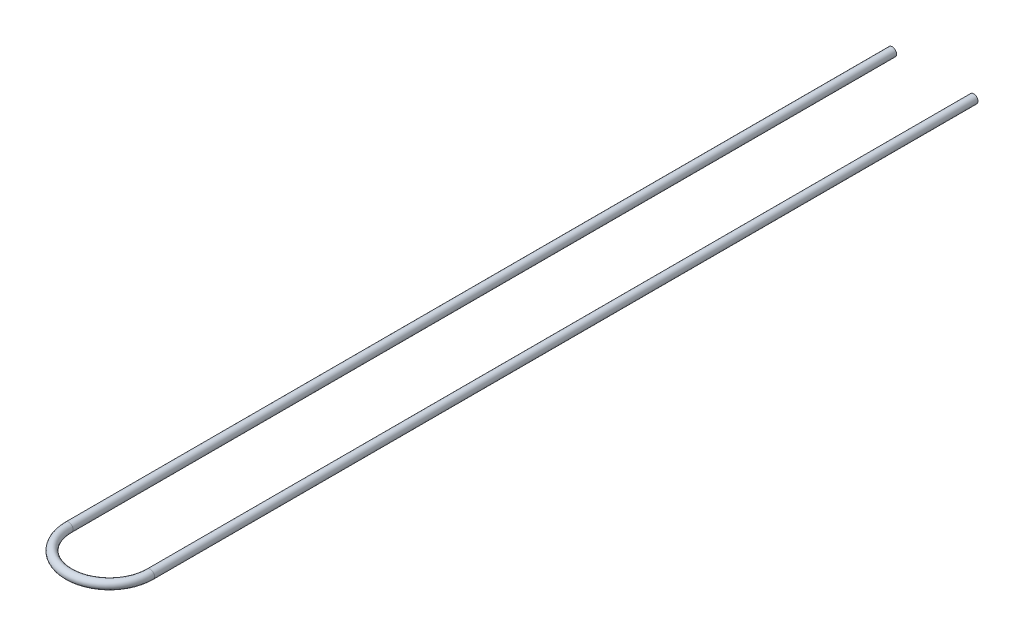
ISO-10303-21;
HEADER;
FILE_DESCRIPTION(('STEP AP214'),'2;1');
FILE_NAME('part.step','',(''),(''),'','','');
FILE_SCHEMA(('AUTOMOTIVE_DESIGN { 1 0 10303 214 1 1 1 1 }'));
ENDSEC;
DATA;
#1=APPLICATION_CONTEXT('core data for automotive mechanical design processes');
#2=APPLICATION_PROTOCOL_DEFINITION('international standard','automotive_design',2000,#1);
#3=PRODUCT_CONTEXT('',#1,'mechanical');
#4=PRODUCT('Part','Part','',(#3));
#5=PRODUCT_RELATED_PRODUCT_CATEGORY('part','',(#4));
#6=PRODUCT_DEFINITION_FORMATION('','',#4);
#7=PRODUCT_DEFINITION_CONTEXT('part definition',#1,'design');
#8=PRODUCT_DEFINITION('design','',#6,#7);
#9=PRODUCT_DEFINITION_SHAPE('','',#8);
#10=(LENGTH_UNIT() NAMED_UNIT(*) SI_UNIT(.MILLI.,.METRE.));
#11=(NAMED_UNIT(*) PLANE_ANGLE_UNIT() SI_UNIT($,.RADIAN.));
#12=(NAMED_UNIT(*) SI_UNIT($,.STERADIAN.) SOLID_ANGLE_UNIT());
#13=UNCERTAINTY_MEASURE_WITH_UNIT(LENGTH_MEASURE(1.E-05),#10,'distance_accuracy_value','');
#14=(GEOMETRIC_REPRESENTATION_CONTEXT(3) GLOBAL_UNCERTAINTY_ASSIGNED_CONTEXT((#13)) GLOBAL_UNIT_ASSIGNED_CONTEXT((#10,
#11,#12)) REPRESENTATION_CONTEXT('',''));
#15=CARTESIAN_POINT('',(0.,0.,0.));
#16=DIRECTION('',(0.,0.,1.));
#17=DIRECTION('',(1.,0.,0.));
#18=AXIS2_PLACEMENT_3D('',#15,#16,#17);
#19=CARTESIAN_POINT('',(-40.,0.,299.999999999999));
#20=DIRECTION('',(0.,0.,1.));
#21=DIRECTION('',(1.,0.,0.));
#22=AXIS2_PLACEMENT_3D('',#19,#20,#21);
#23=CYLINDRICAL_SURFACE('',#22,11.1);
#24=CARTESIAN_POINT('',(-39.9999999999997,0.,2440.));
#25=DIRECTION('',(0.,0.,1.));
#26=DIRECTION('',(1.,0.,0.));
#27=AXIS2_PLACEMENT_3D('',#24,#25,#26);
#28=CIRCLE('',#27,11.1);
#29=CARTESIAN_POINT('',(-51.0999999999997,0.,2440.));
#30=VERTEX_POINT('',#29);
#31=EDGE_CURVE('E52',#30,#30,#28,.T.);
#32=ORIENTED_EDGE('',*,*,#31,.F.);
#33=EDGE_LOOP('',(#32));
#34=FACE_BOUND('',#33,.T.);
#35=CARTESIAN_POINT('',(-40.,0.,299.999999999999));
#36=DIRECTION('',(0.,0.,1.));
#37=DIRECTION('',(1.,0.,0.));
#38=AXIS2_PLACEMENT_3D('',#35,#36,#37);
#39=CIRCLE('',#38,11.1);
#40=CARTESIAN_POINT('',(-28.9,0.,299.999999999999));
#41=VERTEX_POINT('',#40);
#42=EDGE_CURVE('E50',#41,#41,#39,.T.);
#43=ORIENTED_EDGE('',*,*,#42,.T.);
#44=EDGE_LOOP('',(#43));
#45=FACE_BOUND('',#44,.T.);
#46=ADVANCED_FACE('F29',(#34,#45),#23,.T.);
#47=CARTESIAN_POINT('',(65.8450000000003,0.,2440.));
#48=DIRECTION('',(0.,1.,0.));
#49=DIRECTION('',(0.,0.,1.));
#50=AXIS2_PLACEMENT_3D('',#47,#48,#49);
#51=TOROIDAL_SURFACE('',#50,105.845,11.1);
#52=CARTESIAN_POINT('',(171.69,0.,2440.));
#53=DIRECTION('',(0.,0.,-1.));
#54=DIRECTION('',(-1.,0.,0.));
#55=AXIS2_PLACEMENT_3D('',#52,#53,#54);
#56=CIRCLE('',#55,11.1);
#57=CARTESIAN_POINT('',(182.79,0.,2440.));
#58=VERTEX_POINT('',#57);
#59=EDGE_CURVE('E33',#58,#58,#56,.T.);
#60=CARTESIAN_POINT('',(65.8450000000003,0.,2440.));
#61=DIRECTION('',(0.,1.,0.));
#62=DIRECTION('',(0.,0.,1.));
#63=AXIS2_PLACEMENT_3D('',#60,#61,#62);
#64=CIRCLE('',#63,116.945);
#65=EDGE_CURVE('',#30,#58,#64,.T.);
#66=ORIENTED_EDGE('',*,*,#31,.T.);
#67=ORIENTED_EDGE('',*,*,#59,.F.);
#68=ORIENTED_EDGE('',*,*,#65,.T.);
#69=ORIENTED_EDGE('',*,*,#65,.F.);
#70=EDGE_LOOP('',(#66,#68,#67,#69));
#71=FACE_BOUND('',#70,.T.);
#72=ADVANCED_FACE('F60',(#71),#51,.T.);
#73=CARTESIAN_POINT('',(171.69,0.,2440.));
#74=DIRECTION('',(0.,0.,-1.));
#75=DIRECTION('',(-1.,0.,0.));
#76=AXIS2_PLACEMENT_3D('',#73,#74,#75);
#77=CYLINDRICAL_SURFACE('',#76,11.1);
#78=CARTESIAN_POINT('',(171.69,0.,299.999999999999));
#79=DIRECTION('',(0.,0.,-1.));
#80=DIRECTION('',(-1.,0.,0.));
#81=AXIS2_PLACEMENT_3D('',#78,#79,#80);
#82=CIRCLE('',#81,11.1);
#83=CARTESIAN_POINT('',(160.59,0.,299.999999999999));
#84=VERTEX_POINT('',#83);
#85=EDGE_CURVE('E46',#84,#84,#82,.T.);
#86=ORIENTED_EDGE('',*,*,#85,.F.);
#87=EDGE_LOOP('',(#86));
#88=FACE_BOUND('',#87,.T.);
#89=ORIENTED_EDGE('',*,*,#59,.T.);
#90=EDGE_LOOP('',(#89));
#91=FACE_BOUND('',#90,.T.);
#92=ADVANCED_FACE('F31',(#88,#91),#77,.T.);
#93=CARTESIAN_POINT('',(-40.,0.,299.999999999999));
#94=DIRECTION('',(0.,0.,1.));
#95=DIRECTION('',(1.,0.,0.));
#96=AXIS2_PLACEMENT_3D('',#93,#94,#95);
#97=PLANE('',#96);
#98=CARTESIAN_POINT('',(-40.,0.,299.999999999999));
#99=DIRECTION('',(0.,0.,1.));
#100=DIRECTION('',(1.,0.,0.));
#101=AXIS2_PLACEMENT_3D('',#98,#99,#100);
#102=CIRCLE('',#101,9.94999999999998);
#103=CARTESIAN_POINT('',(-30.05,0.,299.999999999999));
#104=VERTEX_POINT('',#103);
#105=EDGE_CURVE('E49',#104,#104,#102,.F.);
#106=ORIENTED_EDGE('',*,*,#105,.F.);
#107=EDGE_LOOP('',(#106));
#108=FACE_BOUND('',#107,.T.);
#109=ORIENTED_EDGE('',*,*,#42,.F.);
#110=EDGE_LOOP('',(#109));
#111=FACE_BOUND('',#110,.T.);
#112=ADVANCED_FACE('F66',(#108,#111),#97,.F.);
#113=CARTESIAN_POINT('',(171.69,0.,299.999999999999));
#114=DIRECTION('',(0.,0.,-1.));
#115=DIRECTION('',(-1.,0.,0.));
#116=AXIS2_PLACEMENT_3D('',#113,#114,#115);
#117=PLANE('',#116);
#118=CARTESIAN_POINT('',(171.69,0.,299.999999999999));
#119=DIRECTION('',(0.,0.,-1.));
#120=DIRECTION('',(-1.,0.,0.));
#121=AXIS2_PLACEMENT_3D('',#118,#119,#120);
#122=CIRCLE('',#121,9.94999999999998);
#123=CARTESIAN_POINT('',(161.74,0.,299.999999999999));
#124=VERTEX_POINT('',#123);
#125=EDGE_CURVE('E10',#124,#124,#122,.F.);
#126=ORIENTED_EDGE('',*,*,#125,.T.);
#127=EDGE_LOOP('',(#126));
#128=FACE_BOUND('',#127,.T.);
#129=ORIENTED_EDGE('',*,*,#85,.T.);
#130=EDGE_LOOP('',(#129));
#131=FACE_BOUND('',#130,.T.);
#132=ADVANCED_FACE('F84',(#128,#131),#117,.T.);
#133=CARTESIAN_POINT('',(-40.,0.,299.999999999999));
#134=DIRECTION('',(0.,0.,1.));
#135=DIRECTION('',(1.,0.,0.));
#136=AXIS2_PLACEMENT_3D('',#133,#134,#135);
#137=CYLINDRICAL_SURFACE('',#136,9.94999999999998);
#138=CARTESIAN_POINT('',(-39.9999999999997,0.,2440.));
#139=DIRECTION('',(0.,0.,1.));
#140=DIRECTION('',(1.,0.,0.));
#141=AXIS2_PLACEMENT_3D('',#138,#139,#140);
#142=CIRCLE('',#141,9.94999999999998);
#143=CARTESIAN_POINT('',(-49.9499999999997,0.,2440.));
#144=VERTEX_POINT('',#143);
#145=EDGE_CURVE('E42',#144,#144,#142,.F.);
#146=ORIENTED_EDGE('',*,*,#145,.F.);
#147=EDGE_LOOP('',(#146));
#148=FACE_BOUND('',#147,.T.);
#149=ORIENTED_EDGE('',*,*,#105,.T.);
#150=EDGE_LOOP('',(#149));
#151=FACE_BOUND('',#150,.T.);
#152=ADVANCED_FACE('F78',(#148,#151),#137,.F.);
#153=CARTESIAN_POINT('',(65.8450000000003,0.,2440.));
#154=DIRECTION('',(0.,1.,0.));
#155=DIRECTION('',(0.,0.,1.));
#156=AXIS2_PLACEMENT_3D('',#153,#154,#155);
#157=TOROIDAL_SURFACE('',#156,105.845,9.94999999999998);
#158=CARTESIAN_POINT('',(171.69,0.,2440.));
#159=DIRECTION('',(0.,0.,-1.));
#160=DIRECTION('',(-1.,0.,0.));
#161=AXIS2_PLACEMENT_3D('',#158,#159,#160);
#162=CIRCLE('',#161,9.94999999999998);
#163=CARTESIAN_POINT('',(181.64,0.,2440.));
#164=VERTEX_POINT('',#163);
#165=EDGE_CURVE('E37',#164,#164,#162,.F.);
#166=CARTESIAN_POINT('',(65.8450000000003,0.,2440.));
#167=DIRECTION('',(0.,1.,0.));
#168=DIRECTION('',(0.,0.,1.));
#169=AXIS2_PLACEMENT_3D('',#166,#167,#168);
#170=CIRCLE('',#169,115.795);
#171=EDGE_CURVE('',#144,#164,#170,.T.);
#172=ORIENTED_EDGE('',*,*,#145,.T.);
#173=ORIENTED_EDGE('',*,*,#165,.F.);
#174=ORIENTED_EDGE('',*,*,#171,.T.);
#175=ORIENTED_EDGE('',*,*,#171,.F.);
#176=EDGE_LOOP('',(#172,#174,#173,#175));
#177=FACE_BOUND('',#176,.T.);
#178=ADVANCED_FACE('F72',(#177),#157,.F.);
#179=CARTESIAN_POINT('',(171.69,0.,2440.));
#180=DIRECTION('',(0.,0.,-1.));
#181=DIRECTION('',(-1.,0.,0.));
#182=AXIS2_PLACEMENT_3D('',#179,#180,#181);
#183=CYLINDRICAL_SURFACE('',#182,9.94999999999998);
#184=ORIENTED_EDGE('',*,*,#125,.F.);
#185=EDGE_LOOP('',(#184));
#186=FACE_BOUND('',#185,.T.);
#187=ORIENTED_EDGE('',*,*,#165,.T.);
#188=EDGE_LOOP('',(#187));
#189=FACE_BOUND('',#188,.T.);
#190=ADVANCED_FACE('F70',(#186,#189),#183,.F.);
#191=CLOSED_SHELL('',(#46,#72,#92,#112,#132,#152,#178,#190));
#192=MANIFOLD_SOLID_BREP('B2',#191);
#193=ADVANCED_BREP_SHAPE_REPRESENTATION('',(#18,#192),#14);
#194=SHAPE_DEFINITION_REPRESENTATION(#9,#193);
ENDSEC;
END-ISO-10303-21;
